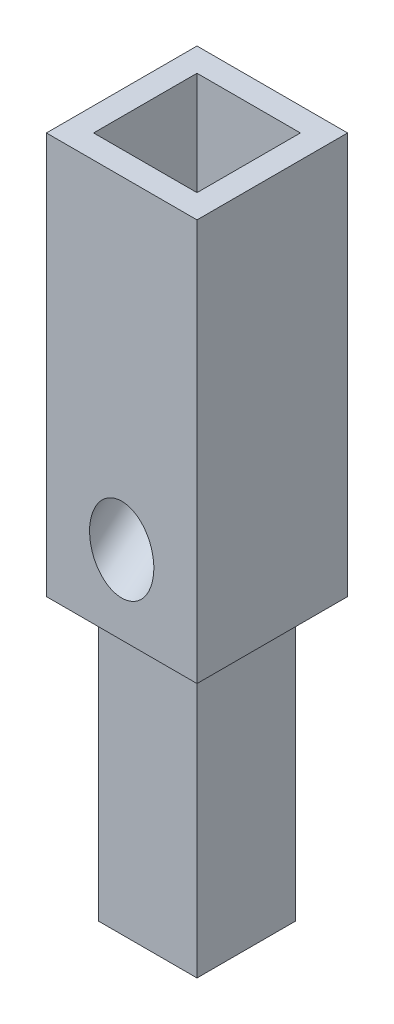
ISO-10303-21;
HEADER;
FILE_DESCRIPTION(('STEP AP214'),'2;1');
FILE_NAME('part.step','',(''),(''),'','','');
FILE_SCHEMA(('AUTOMOTIVE_DESIGN { 1 0 10303 214 1 1 1 1 }'));
ENDSEC;
DATA;
#1=APPLICATION_CONTEXT('core data for automotive mechanical design processes');
#2=APPLICATION_PROTOCOL_DEFINITION('international standard','automotive_design',2000,#1);
#3=PRODUCT_CONTEXT('',#1,'mechanical');
#4=PRODUCT('Part','Part','',(#3));
#5=PRODUCT_RELATED_PRODUCT_CATEGORY('part','',(#4));
#6=PRODUCT_DEFINITION_FORMATION('','',#4);
#7=PRODUCT_DEFINITION_CONTEXT('part definition',#1,'design');
#8=PRODUCT_DEFINITION('design','',#6,#7);
#9=PRODUCT_DEFINITION_SHAPE('','',#8);
#10=(LENGTH_UNIT() NAMED_UNIT(*) SI_UNIT(.MILLI.,.METRE.));
#11=(NAMED_UNIT(*) PLANE_ANGLE_UNIT() SI_UNIT($,.RADIAN.));
#12=(NAMED_UNIT(*) SI_UNIT($,.STERADIAN.) SOLID_ANGLE_UNIT());
#13=UNCERTAINTY_MEASURE_WITH_UNIT(LENGTH_MEASURE(1.E-05),#10,'distance_accuracy_value','');
#14=(GEOMETRIC_REPRESENTATION_CONTEXT(3) GLOBAL_UNCERTAINTY_ASSIGNED_CONTEXT((#13)) GLOBAL_UNIT_ASSIGNED_CONTEXT((#10,
#11,#12)) REPRESENTATION_CONTEXT('',''));
#15=CARTESIAN_POINT('',(0.,0.,0.));
#16=DIRECTION('',(0.,0.,1.));
#17=DIRECTION('',(1.,0.,0.));
#18=AXIS2_PLACEMENT_3D('',#15,#16,#17);
#19=CARTESIAN_POINT('',(0.,40.,0.));
#20=DIRECTION('',(0.,-1.,0.));
#21=DIRECTION('',(0.,0.,-1.));
#22=AXIS2_PLACEMENT_3D('',#19,#20,#21);
#23=CYLINDRICAL_SURFACE('',#22,1.5);
#24=CARTESIAN_POINT('',(0.,-22.,0.));
#25=DIRECTION('',(0.,-1.,0.));
#26=DIRECTION('',(0.,0.,-1.));
#27=AXIS2_PLACEMENT_3D('',#24,#25,#26);
#28=CIRCLE('',#27,1.5);
#29=CARTESIAN_POINT('',(0.,-22.,-1.5));
#30=VERTEX_POINT('',#29);
#31=EDGE_CURVE('E191',#30,#30,#28,.F.);
#32=ORIENTED_EDGE('',*,*,#31,.F.);
#33=EDGE_LOOP('',(#32));
#34=FACE_BOUND('',#33,.T.);
#35=CARTESIAN_POINT('',(0.,8.86246899813989,0.));
#36=DIRECTION('',(0.,0.642787609686543,-0.766044443118975));
#37=DIRECTION('',(0.,-0.766044443118975,-0.642787609686543));
#38=AXIS2_PLACEMENT_3D('',#35,#36,#37);
#39=ELLIPSE('',#38,2.3335857402906,1.5);
#40=CARTESIAN_POINT('',(-1.32342374985116,9.70394289122004,0.706080433328866));
#41=VERTEX_POINT('',#40);
#42=CARTESIAN_POINT('',(1.32342374985116,9.70394289122004,0.706080433328869));
#43=VERTEX_POINT('',#42);
#44=EDGE_CURVE('E144',#41,#43,#39,.F.);
#45=ORIENTED_EDGE('',*,*,#44,.F.);
#46=CARTESIAN_POINT('',(-1.32342374985116,9.70394289122003,0.706080433328872));
#47=CARTESIAN_POINT('',(-1.29809805979963,9.64918894404574,0.753464789128271));
#48=CARTESIAN_POINT('',(-1.27025618535511,9.59446845614418,0.799595815889314));
#49=CARTESIAN_POINT('',(-1.20914240775964,9.48560571786241,0.889363305520722));
#50=CARTESIAN_POINT('',(-1.17584985773644,9.43146653434773,0.932989396374026));
#51=CARTESIAN_POINT('',(-1.10313135384855,9.32397800446016,1.01797062923041));
#52=CARTESIAN_POINT('',(-1.06362717608213,9.2706498344641,1.05928617517818));
#53=CARTESIAN_POINT('',(-0.978349076067662,9.1666908168111,1.13851567754857));
#54=CARTESIAN_POINT('',(-0.932586580661705,9.1160552815575,1.17643562972124));
#55=CARTESIAN_POINT('',(-0.838894902925371,9.02365103594939,1.24469836110505));
#56=CARTESIAN_POINT('',(-0.791625119704653,8.98150041979813,1.27541960074314));
#57=CARTESIAN_POINT('',(-0.690859753028765,8.90212519664404,1.33269056093925));
#58=CARTESIAN_POINT('',(-0.637373128256204,8.86489366252349,1.35924615770489));
#59=CARTESIAN_POINT('',(-0.522858886092545,8.79697945956512,1.4073153649948));
#60=CARTESIAN_POINT('',(-0.461724661126474,8.76641063190946,1.42874186474205));
#61=CARTESIAN_POINT('',(-0.333230096387986,8.71583884720162,1.46401586334333));
#62=CARTESIAN_POINT('',(-0.265893601792679,8.6957972588482,1.47789107964277));
#63=CARTESIAN_POINT('',(-0.149217563705861,8.67345801481185,1.49333021073063));
#64=CARTESIAN_POINT('',(-0.100888692725763,8.66756001412028,1.49739516103013));
#65=CARTESIAN_POINT('',(-0.00370701040952694,8.66264860265226,1.50078090828461));
#66=CARTESIAN_POINT('',(0.0451456520270447,8.66363328454895,1.5001030195736));
#67=CARTESIAN_POINT('',(0.141834857734815,8.67238953806387,1.49406435795262));
#68=CARTESIAN_POINT('',(0.189673058359401,8.68014899810762,1.48871194189977));
#69=CARTESIAN_POINT('',(0.283259561541475,8.70173141924471,1.4737759897235));
#70=CARTESIAN_POINT('',(0.329006441841132,8.71555844095048,1.46418962007076));
#71=CARTESIAN_POINT('',(0.43529722336835,8.75477854636256,1.43687398682346));
#72=CARTESIAN_POINT('',(0.494502806780166,8.78258416475726,1.41742282808018));
#73=CARTESIAN_POINT('',(0.606781721179693,8.84534669414839,1.37312774064124));
#74=CARTESIAN_POINT('',(0.659839671340787,8.88032096046678,1.348270715238));
#75=CARTESIAN_POINT('',(0.788560100661072,8.97656564616294,1.27912342030214));
#76=CARTESIAN_POINT('',(0.859867923334039,9.04146147922713,1.23183241605552));
#77=CARTESIAN_POINT('',(0.989821179658713,9.17805008031879,1.13008424664213));
#78=CARTESIAN_POINT('',(1.04842320145953,9.24976498301355,1.07560350518714));
#79=CARTESIAN_POINT('',(1.14620876264468,9.38533435498894,0.969816364484091));
#80=CARTESIAN_POINT('',(1.18699420389934,9.4486848060689,0.919326302645739));
#81=CARTESIAN_POINT('',(1.24242188833636,9.54430816091368,0.841068017279851));
#82=CARTESIAN_POINT('',(1.25986973447346,9.57612932665661,0.814692858657374));
#83=CARTESIAN_POINT('',(1.29297694096266,9.63993895889759,0.761052632581956));
#84=CARTESIAN_POINT('',(1.30863667160881,9.67192738931728,0.733787750887584));
#85=CARTESIAN_POINT('',(1.32342374985116,9.70394289122003,0.706080433328873));
#86=B_SPLINE_CURVE_WITH_KNOTS('',3,(#46,#47,#48,#49,#50,#51,#52,#53,#54,#55,#56,#57,#58,#59,#60,
#61,#62,#63,#64,#65,#66,#67,#68,#69,#70,#71,#72,#73,#74,#75,#76,#77,#78,#79,#80,#81,#82,#83,#84,
#85),.UNSPECIFIED.,.F.,.F.,(4,2,2,2,2,2,2,2,2,2,2,2,2,2,2,2,2,2,2,4),(0.,0.23013199328184,
0.461156788512066,0.695366321999815,0.929153792214539,1.13987180272697,1.3502898405558,
1.56406173375028,1.7770435792355,1.92295141975555,2.06881882794367,2.21442599515704,
2.36013075645666,2.5636980042364,2.76776403699354,3.08815153310026,3.40961702287541,
3.68126800608189,3.81581825177724,3.95034058324462),.UNSPECIFIED.);
#87=EDGE_CURVE('E48',#41,#43,#86,.T.);
#88=ORIENTED_EDGE('',*,*,#87,.T.);
#89=EDGE_LOOP('',(#45,#88));
#90=FACE_BOUND('',#89,.T.);
#91=ADVANCED_FACE('F35',(#34,#90),#23,.F.);
#92=CARTESIAN_POINT('',(0.,15.,0.));
#93=DIRECTION('',(0.,1.,0.));
#94=DIRECTION('',(0.,0.,1.));
#95=AXIS2_PLACEMENT_3D('',#92,#93,#94);
#96=PLANE('',#95);
#97=DIRECTION('',(0.,0.,1.));
#98=VECTOR('',#97,1.);
#99=CARTESIAN_POINT('',(-5.15,15.,5.15));
#100=LINE('',#99,#98);
#101=CARTESIAN_POINT('',(-5.15,15.,-5.15));
#102=VERTEX_POINT('',#101);
#103=CARTESIAN_POINT('',(-5.15,15.,-4.95));
#104=VERTEX_POINT('',#103);
#105=EDGE_CURVE('E161',#102,#104,#100,.T.);
#106=ORIENTED_EDGE('',*,*,#105,.T.);
#107=DIRECTION('',(1.,0.,0.));
#108=VECTOR('',#107,1.);
#109=CARTESIAN_POINT('',(-20.8628106512901,15.,-4.95));
#110=LINE('',#109,#108);
#111=CARTESIAN_POINT('',(5.15,15.,-4.95));
#112=VERTEX_POINT('',#111);
#113=EDGE_CURVE('E145',#104,#112,#110,.T.);
#114=ORIENTED_EDGE('',*,*,#113,.T.);
#115=DIRECTION('',(0.,0.,-1.));
#116=VECTOR('',#115,1.);
#117=CARTESIAN_POINT('',(5.15,15.,5.15));
#118=LINE('',#117,#116);
#119=CARTESIAN_POINT('',(5.15,15.,-5.15000000000001));
#120=VERTEX_POINT('',#119);
#121=EDGE_CURVE('E167',#112,#120,#118,.T.);
#122=ORIENTED_EDGE('',*,*,#121,.T.);
#123=DIRECTION('',(-1.,0.,0.));
#124=VECTOR('',#123,1.);
#125=CARTESIAN_POINT('',(5.15,15.,-5.15000000000001));
#126=LINE('',#125,#124);
#127=EDGE_CURVE('E169',#120,#102,#126,.T.);
#128=ORIENTED_EDGE('',*,*,#127,.T.);
#129=EDGE_LOOP('',(#106,#114,#122,#128));
#130=FACE_BOUND('',#129,.T.);
#131=ADVANCED_FACE('F261',(#130),#96,.T.);
#132=CARTESIAN_POINT('',(0.,0.,0.));
#133=DIRECTION('',(0.,1.,0.));
#134=DIRECTION('',(0.,0.,1.));
#135=AXIS2_PLACEMENT_3D('',#132,#133,#134);
#136=PLANE('',#135);
#137=DIRECTION('',(0.,0.,1.));
#138=VECTOR('',#137,1.);
#139=CARTESIAN_POINT('',(-7.5,0.,7.5));
#140=LINE('',#139,#138);
#141=CARTESIAN_POINT('',(-7.5,0.,-7.5));
#142=VERTEX_POINT('',#141);
#143=CARTESIAN_POINT('',(-7.5,0.,7.5));
#144=VERTEX_POINT('',#143);
#145=EDGE_CURVE('E227',#142,#144,#140,.T.);
#146=ORIENTED_EDGE('',*,*,#145,.F.);
#147=DIRECTION('',(-1.,0.,0.));
#148=VECTOR('',#147,1.);
#149=CARTESIAN_POINT('',(7.5,0.,-7.50000000000001));
#150=LINE('',#149,#148);
#151=CARTESIAN_POINT('',(7.5,0.,-7.50000000000001));
#152=VERTEX_POINT('',#151);
#153=EDGE_CURVE('E232',#152,#142,#150,.T.);
#154=ORIENTED_EDGE('',*,*,#153,.F.);
#155=DIRECTION('',(0.,0.,-1.));
#156=VECTOR('',#155,1.);
#157=CARTESIAN_POINT('',(7.5,0.,7.49999999999999));
#158=LINE('',#157,#156);
#159=CARTESIAN_POINT('',(7.5,0.,7.49999999999999));
#160=VERTEX_POINT('',#159);
#161=EDGE_CURVE('E243',#160,#152,#158,.T.);
#162=ORIENTED_EDGE('',*,*,#161,.F.);
#163=DIRECTION('',(1.,0.,0.));
#164=VECTOR('',#163,1.);
#165=CARTESIAN_POINT('',(7.5,0.,7.49999999999999));
#166=LINE('',#165,#164);
#167=EDGE_CURVE('E241',#144,#160,#166,.T.);
#168=ORIENTED_EDGE('',*,*,#167,.F.);
#169=EDGE_LOOP('',(#146,#154,#162,#168));
#170=FACE_BOUND('',#169,.T.);
#171=DIRECTION('',(0.,0.,1.));
#172=VECTOR('',#171,1.);
#173=CARTESIAN_POINT('',(4.9,0.,4.9));
#174=LINE('',#173,#172);
#175=CARTESIAN_POINT('',(4.9,0.,-4.9));
#176=VERTEX_POINT('',#175);
#177=CARTESIAN_POINT('',(4.9,0.,4.9));
#178=VERTEX_POINT('',#177);
#179=EDGE_CURVE('E205',#176,#178,#174,.T.);
#180=ORIENTED_EDGE('',*,*,#179,.F.);
#181=DIRECTION('',(1.,0.,0.));
#182=VECTOR('',#181,1.);
#183=CARTESIAN_POINT('',(-4.9,0.,-4.9));
#184=LINE('',#183,#182);
#185=CARTESIAN_POINT('',(-4.9,0.,-4.9));
#186=VERTEX_POINT('',#185);
#187=EDGE_CURVE('E198',#186,#176,#184,.T.);
#188=ORIENTED_EDGE('',*,*,#187,.F.);
#189=DIRECTION('',(0.,0.,-1.));
#190=VECTOR('',#189,1.);
#191=CARTESIAN_POINT('',(-4.9,0.,4.9));
#192=LINE('',#191,#190);
#193=CARTESIAN_POINT('',(-4.9,0.,4.9));
#194=VERTEX_POINT('',#193);
#195=EDGE_CURVE('E211',#194,#186,#192,.T.);
#196=ORIENTED_EDGE('',*,*,#195,.F.);
#197=DIRECTION('',(-1.,0.,0.));
#198=VECTOR('',#197,1.);
#199=CARTESIAN_POINT('',(-4.9,0.,4.9));
#200=LINE('',#199,#198);
#201=EDGE_CURVE('E208',#178,#194,#200,.T.);
#202=ORIENTED_EDGE('',*,*,#201,.F.);
#203=EDGE_LOOP('',(#180,#188,#196,#202));
#204=FACE_BOUND('',#203,.T.);
#205=ADVANCED_FACE('F266',(#170,#204),#136,.F.);
#206=CARTESIAN_POINT('',(-7.5,40.,7.5));
#207=DIRECTION('',(1.,0.,0.));
#208=DIRECTION('',(0.,0.,-1.));
#209=AXIS2_PLACEMENT_3D('',#206,#207,#208);
#210=PLANE('',#209);
#211=ORIENTED_EDGE('',*,*,#145,.T.);
#212=DIRECTION('',(0.,-1.,0.));
#213=VECTOR('',#212,1.);
#214=CARTESIAN_POINT('',(-7.5,40.,7.5));
#215=LINE('',#214,#213);
#216=CARTESIAN_POINT('',(-7.5,40.,7.5));
#217=VERTEX_POINT('',#216);
#218=EDGE_CURVE('E43',#217,#144,#215,.T.);
#219=ORIENTED_EDGE('',*,*,#218,.F.);
#220=DIRECTION('',(0.,0.,1.));
#221=VECTOR('',#220,1.);
#222=CARTESIAN_POINT('',(-7.5,40.,7.5));
#223=LINE('',#222,#221);
#224=CARTESIAN_POINT('',(-7.5,40.,-7.5));
#225=VERTEX_POINT('',#224);
#226=EDGE_CURVE('E228',#225,#217,#223,.T.);
#227=ORIENTED_EDGE('',*,*,#226,.F.);
#228=DIRECTION('',(0.,-1.,0.));
#229=VECTOR('',#228,1.);
#230=CARTESIAN_POINT('',(-7.5,40.,-7.5));
#231=LINE('',#230,#229);
#232=EDGE_CURVE('E238',#225,#142,#231,.T.);
#233=ORIENTED_EDGE('',*,*,#232,.T.);
#234=EDGE_LOOP('',(#211,#219,#227,#233));
#235=FACE_BOUND('',#234,.T.);
#236=ADVANCED_FACE('F37',(#235),#210,.F.);
#237=CARTESIAN_POINT('',(7.5,40.,7.49999999999999));
#238=DIRECTION('',(0.,0.,-1.));
#239=DIRECTION('',(-1.,0.,0.));
#240=AXIS2_PLACEMENT_3D('',#237,#238,#239);
#241=PLANE('',#240);
#242=CARTESIAN_POINT('',(0.,7.80648670940424,7.49999999999999));
#243=DIRECTION('',(0.,0.,-1.));
#244=DIRECTION('',(0.,1.,0.));
#245=AXIS2_PLACEMENT_3D('',#242,#243,#244);
#246=ELLIPSE('',#245,4.17730332586331,3.2);
#247=CARTESIAN_POINT('',(0.,11.9837900352675,7.49999999999999));
#248=VERTEX_POINT('',#247);
#249=EDGE_CURVE('E146',#248,#248,#246,.T.);
#250=ORIENTED_EDGE('',*,*,#249,.T.);
#251=EDGE_LOOP('',(#250));
#252=FACE_BOUND('',#251,.T.);
#253=ORIENTED_EDGE('',*,*,#167,.T.);
#254=DIRECTION('',(0.,-1.,0.));
#255=VECTOR('',#254,1.);
#256=CARTESIAN_POINT('',(7.5,40.,7.49999999999999));
#257=LINE('',#256,#255);
#258=CARTESIAN_POINT('',(7.5,40.,7.49999999999999));
#259=VERTEX_POINT('',#258);
#260=EDGE_CURVE('E251',#259,#160,#257,.T.);
#261=ORIENTED_EDGE('',*,*,#260,.F.);
#262=DIRECTION('',(1.,0.,0.));
#263=VECTOR('',#262,1.);
#264=CARTESIAN_POINT('',(7.5,40.,7.49999999999999));
#265=LINE('',#264,#263);
#266=EDGE_CURVE('E231',#217,#259,#265,.T.);
#267=ORIENTED_EDGE('',*,*,#266,.F.);
#268=ORIENTED_EDGE('',*,*,#218,.T.);
#269=EDGE_LOOP('',(#253,#261,#267,#268));
#270=FACE_BOUND('',#269,.T.);
#271=ADVANCED_FACE('F342',(#252,#270),#241,.F.);
#272=CARTESIAN_POINT('',(7.5,40.,7.49999999999999));
#273=DIRECTION('',(-1.,0.,0.));
#274=DIRECTION('',(0.,0.,1.));
#275=AXIS2_PLACEMENT_3D('',#272,#273,#274);
#276=PLANE('',#275);
#277=ORIENTED_EDGE('',*,*,#161,.T.);
#278=DIRECTION('',(0.,-1.,0.));
#279=VECTOR('',#278,1.);
#280=CARTESIAN_POINT('',(7.5,40.,-7.50000000000001));
#281=LINE('',#280,#279);
#282=CARTESIAN_POINT('',(7.5,40.,-7.50000000000001));
#283=VERTEX_POINT('',#282);
#284=EDGE_CURVE('E248',#283,#152,#281,.T.);
#285=ORIENTED_EDGE('',*,*,#284,.F.);
#286=DIRECTION('',(0.,0.,-1.));
#287=VECTOR('',#286,1.);
#288=CARTESIAN_POINT('',(7.5,40.,7.49999999999999));
#289=LINE('',#288,#287);
#290=EDGE_CURVE('E234',#259,#283,#289,.T.);
#291=ORIENTED_EDGE('',*,*,#290,.F.);
#292=ORIENTED_EDGE('',*,*,#260,.T.);
#293=EDGE_LOOP('',(#277,#285,#291,#292));
#294=FACE_BOUND('',#293,.T.);
#295=ADVANCED_FACE('F352',(#294),#276,.F.);
#296=CARTESIAN_POINT('',(7.5,40.,-7.50000000000001));
#297=DIRECTION('',(0.,0.,1.));
#298=DIRECTION('',(1.,0.,0.));
#299=AXIS2_PLACEMENT_3D('',#296,#297,#298);
#300=PLANE('',#299);
#301=ORIENTED_EDGE('',*,*,#153,.T.);
#302=ORIENTED_EDGE('',*,*,#232,.F.);
#303=DIRECTION('',(-1.,0.,0.));
#304=VECTOR('',#303,1.);
#305=CARTESIAN_POINT('',(7.5,40.,-7.50000000000001));
#306=LINE('',#305,#304);
#307=EDGE_CURVE('E236',#283,#225,#306,.T.);
#308=ORIENTED_EDGE('',*,*,#307,.F.);
#309=ORIENTED_EDGE('',*,*,#284,.T.);
#310=EDGE_LOOP('',(#301,#302,#308,#309));
#311=FACE_BOUND('',#310,.T.);
#312=ADVANCED_FACE('F349',(#311),#300,.F.);
#313=CARTESIAN_POINT('',(0.,40.,0.));
#314=DIRECTION('',(0.,1.,0.));
#315=DIRECTION('',(0.,0.,1.));
#316=AXIS2_PLACEMENT_3D('',#313,#314,#315);
#317=PLANE('',#316);
#318=DIRECTION('',(0.,0.,1.));
#319=VECTOR('',#318,1.);
#320=CARTESIAN_POINT('',(-5.15,40.,5.15));
#321=LINE('',#320,#319);
#322=CARTESIAN_POINT('',(-5.15,40.,-5.15));
#323=VERTEX_POINT('',#322);
#324=CARTESIAN_POINT('',(-5.15,40.,5.15));
#325=VERTEX_POINT('',#324);
#326=EDGE_CURVE('E56',#323,#325,#321,.T.);
#327=ORIENTED_EDGE('',*,*,#326,.F.);
#328=DIRECTION('',(-1.,0.,0.));
#329=VECTOR('',#328,1.);
#330=CARTESIAN_POINT('',(5.15,40.,-5.15000000000001));
#331=LINE('',#330,#329);
#332=CARTESIAN_POINT('',(5.15,40.,-5.15000000000001));
#333=VERTEX_POINT('',#332);
#334=EDGE_CURVE('E165',#333,#323,#331,.T.);
#335=ORIENTED_EDGE('',*,*,#334,.F.);
#336=DIRECTION('',(0.,0.,-1.));
#337=VECTOR('',#336,1.);
#338=CARTESIAN_POINT('',(5.15,40.,5.15));
#339=LINE('',#338,#337);
#340=CARTESIAN_POINT('',(5.15,40.,5.15));
#341=VERTEX_POINT('',#340);
#342=EDGE_CURVE('E175',#341,#333,#339,.T.);
#343=ORIENTED_EDGE('',*,*,#342,.F.);
#344=DIRECTION('',(1.,0.,0.));
#345=VECTOR('',#344,1.);
#346=CARTESIAN_POINT('',(5.15,40.,5.15));
#347=LINE('',#346,#345);
#348=EDGE_CURVE('E152',#325,#341,#347,.T.);
#349=ORIENTED_EDGE('',*,*,#348,.F.);
#350=EDGE_LOOP('',(#327,#335,#343,#349));
#351=FACE_BOUND('',#350,.T.);
#352=ORIENTED_EDGE('',*,*,#226,.T.);
#353=ORIENTED_EDGE('',*,*,#266,.T.);
#354=ORIENTED_EDGE('',*,*,#290,.T.);
#355=ORIENTED_EDGE('',*,*,#307,.T.);
#356=EDGE_LOOP('',(#352,#353,#354,#355));
#357=FACE_BOUND('',#356,.T.);
#358=ADVANCED_FACE('F347',(#351,#357),#317,.T.);
#359=CARTESIAN_POINT('',(4.9,-28.,4.9));
#360=DIRECTION('',(-1.,0.,0.));
#361=DIRECTION('',(0.,0.,1.));
#362=AXIS2_PLACEMENT_3D('',#359,#360,#361);
#363=PLANE('',#362);
#364=ORIENTED_EDGE('',*,*,#179,.T.);
#365=DIRECTION('',(0.,1.,0.));
#366=VECTOR('',#365,1.);
#367=CARTESIAN_POINT('',(4.9,-28.,4.9));
#368=LINE('',#367,#366);
#369=CARTESIAN_POINT('',(4.9,-28.,4.9));
#370=VERTEX_POINT('',#369);
#371=EDGE_CURVE('E224',#370,#178,#368,.T.);
#372=ORIENTED_EDGE('',*,*,#371,.F.);
#373=DIRECTION('',(0.,0.,1.));
#374=VECTOR('',#373,1.);
#375=CARTESIAN_POINT('',(4.9,-28.,4.9));
#376=LINE('',#375,#374);
#377=CARTESIAN_POINT('',(4.9,-28.,-4.9));
#378=VERTEX_POINT('',#377);
#379=EDGE_CURVE('E194',#378,#370,#376,.T.);
#380=ORIENTED_EDGE('',*,*,#379,.F.);
#381=DIRECTION('',(0.,1.,0.));
#382=VECTOR('',#381,1.);
#383=CARTESIAN_POINT('',(4.9,-28.,-4.9));
#384=LINE('',#383,#382);
#385=EDGE_CURVE('E204',#378,#176,#384,.T.);
#386=ORIENTED_EDGE('',*,*,#385,.T.);
#387=EDGE_LOOP('',(#364,#372,#380,#386));
#388=FACE_BOUND('',#387,.T.);
#389=ADVANCED_FACE('F327',(#388),#363,.F.);
#390=CARTESIAN_POINT('',(-4.9,-28.,4.9));
#391=DIRECTION('',(0.,0.,-1.));
#392=DIRECTION('',(-1.,0.,0.));
#393=AXIS2_PLACEMENT_3D('',#390,#391,#392);
#394=PLANE('',#393);
#395=ORIENTED_EDGE('',*,*,#201,.T.);
#396=DIRECTION('',(0.,1.,0.));
#397=VECTOR('',#396,1.);
#398=CARTESIAN_POINT('',(-4.9,-28.,4.9));
#399=LINE('',#398,#397);
#400=CARTESIAN_POINT('',(-4.9,-28.,4.9));
#401=VERTEX_POINT('',#400);
#402=EDGE_CURVE('E221',#401,#194,#399,.T.);
#403=ORIENTED_EDGE('',*,*,#402,.F.);
#404=DIRECTION('',(-1.,0.,0.));
#405=VECTOR('',#404,1.);
#406=CARTESIAN_POINT('',(-4.9,-28.,4.9));
#407=LINE('',#406,#405);
#408=EDGE_CURVE('E197',#370,#401,#407,.T.);
#409=ORIENTED_EDGE('',*,*,#408,.F.);
#410=ORIENTED_EDGE('',*,*,#371,.T.);
#411=EDGE_LOOP('',(#395,#403,#409,#410));
#412=FACE_BOUND('',#411,.T.);
#413=ADVANCED_FACE('F329',(#412),#394,.F.);
#414=CARTESIAN_POINT('',(-4.9,-28.,4.9));
#415=DIRECTION('',(1.,0.,0.));
#416=DIRECTION('',(0.,0.,-1.));
#417=AXIS2_PLACEMENT_3D('',#414,#415,#416);
#418=PLANE('',#417);
#419=ORIENTED_EDGE('',*,*,#195,.T.);
#420=DIRECTION('',(0.,1.,0.));
#421=VECTOR('',#420,1.);
#422=CARTESIAN_POINT('',(-4.9,-28.,-4.9));
#423=LINE('',#422,#421);
#424=CARTESIAN_POINT('',(-4.9,-28.,-4.9));
#425=VERTEX_POINT('',#424);
#426=EDGE_CURVE('E218',#425,#186,#423,.T.);
#427=ORIENTED_EDGE('',*,*,#426,.F.);
#428=DIRECTION('',(0.,0.,-1.));
#429=VECTOR('',#428,1.);
#430=CARTESIAN_POINT('',(-4.9,-28.,4.9));
#431=LINE('',#430,#429);
#432=EDGE_CURVE('E200',#401,#425,#431,.T.);
#433=ORIENTED_EDGE('',*,*,#432,.F.);
#434=ORIENTED_EDGE('',*,*,#402,.T.);
#435=EDGE_LOOP('',(#419,#427,#433,#434));
#436=FACE_BOUND('',#435,.T.);
#437=ADVANCED_FACE('F333',(#436),#418,.F.);
#438=CARTESIAN_POINT('',(-4.9,-28.,-4.9));
#439=DIRECTION('',(0.,0.,1.));
#440=DIRECTION('',(1.,0.,0.));
#441=AXIS2_PLACEMENT_3D('',#438,#439,#440);
#442=PLANE('',#441);
#443=ORIENTED_EDGE('',*,*,#187,.T.);
#444=ORIENTED_EDGE('',*,*,#385,.F.);
#445=DIRECTION('',(1.,0.,0.));
#446=VECTOR('',#445,1.);
#447=CARTESIAN_POINT('',(-4.9,-28.,-4.9));
#448=LINE('',#447,#446);
#449=EDGE_CURVE('E202',#425,#378,#448,.T.);
#450=ORIENTED_EDGE('',*,*,#449,.F.);
#451=ORIENTED_EDGE('',*,*,#426,.T.);
#452=EDGE_LOOP('',(#443,#444,#450,#451));
#453=FACE_BOUND('',#452,.T.);
#454=ADVANCED_FACE('F315',(#453),#442,.F.);
#455=CARTESIAN_POINT('',(0.,-28.,0.));
#456=DIRECTION('',(0.,-1.,0.));
#457=DIRECTION('',(0.,0.,-1.));
#458=AXIS2_PLACEMENT_3D('',#455,#456,#457);
#459=PLANE('',#458);
#460=CARTESIAN_POINT('',(0.,-28.,0.));
#461=DIRECTION('',(0.,-1.,0.));
#462=DIRECTION('',(0.,0.,-1.));
#463=AXIS2_PLACEMENT_3D('',#460,#461,#462);
#464=CIRCLE('',#463,3.5);
#465=CARTESIAN_POINT('',(0.,-28.,-3.5));
#466=VERTEX_POINT('',#465);
#467=EDGE_CURVE('E182',#466,#466,#464,.T.);
#468=ORIENTED_EDGE('',*,*,#467,.F.);
#469=EDGE_LOOP('',(#468));
#470=FACE_BOUND('',#469,.T.);
#471=ORIENTED_EDGE('',*,*,#379,.T.);
#472=ORIENTED_EDGE('',*,*,#408,.T.);
#473=ORIENTED_EDGE('',*,*,#432,.T.);
#474=ORIENTED_EDGE('',*,*,#449,.T.);
#475=EDGE_LOOP('',(#471,#472,#473,#474));
#476=FACE_BOUND('',#475,.T.);
#477=ADVANCED_FACE('F274',(#470,#476),#459,.T.);
#478=CARTESIAN_POINT('',(0.,-22.,0.));
#479=DIRECTION('',(0.,-1.,0.));
#480=DIRECTION('',(0.,0.,-1.));
#481=AXIS2_PLACEMENT_3D('',#478,#479,#480);
#482=PLANE('',#481);
#483=CARTESIAN_POINT('',(0.,-22.,0.));
#484=DIRECTION('',(0.,-1.,0.));
#485=DIRECTION('',(0.,0.,-1.));
#486=AXIS2_PLACEMENT_3D('',#483,#484,#485);
#487=CIRCLE('',#486,3.5);
#488=CARTESIAN_POINT('',(0.,-22.,-3.5));
#489=VERTEX_POINT('',#488);
#490=EDGE_CURVE('E188',#489,#489,#487,.T.);
#491=ORIENTED_EDGE('',*,*,#490,.T.);
#492=EDGE_LOOP('',(#491));
#493=FACE_BOUND('',#492,.T.);
#494=ORIENTED_EDGE('',*,*,#31,.T.);
#495=EDGE_LOOP('',(#494));
#496=FACE_BOUND('',#495,.T.);
#497=ADVANCED_FACE('F258',(#493,#496),#482,.T.);
#498=CARTESIAN_POINT('',(0.,-22.,0.));
#499=DIRECTION('',(0.,-1.,0.));
#500=DIRECTION('',(0.,0.,-1.));
#501=AXIS2_PLACEMENT_3D('',#498,#499,#500);
#502=CYLINDRICAL_SURFACE('',#501,3.5);
#503=ORIENTED_EDGE('',*,*,#490,.F.);
#504=EDGE_LOOP('',(#503));
#505=FACE_BOUND('',#504,.T.);
#506=ORIENTED_EDGE('',*,*,#467,.T.);
#507=EDGE_LOOP('',(#506));
#508=FACE_BOUND('',#507,.T.);
#509=ADVANCED_FACE('F272',(#505,#508),#502,.F.);
#510=CARTESIAN_POINT('',(-5.15,15.,5.15));
#511=DIRECTION('',(-1.,0.,0.));
#512=DIRECTION('',(0.,0.,1.));
#513=AXIS2_PLACEMENT_3D('',#510,#511,#512);
#514=PLANE('',#513);
#515=ORIENTED_EDGE('',*,*,#326,.T.);
#516=DIRECTION('',(0.,1.,0.));
#517=VECTOR('',#516,1.);
#518=CARTESIAN_POINT('',(-5.15,15.,5.15));
#519=LINE('',#518,#517);
#520=CARTESIAN_POINT('',(-5.15,15.,5.15));
#521=VERTEX_POINT('',#520);
#522=EDGE_CURVE('E171',#521,#325,#519,.T.);
#523=ORIENTED_EDGE('',*,*,#522,.F.);
#524=DIRECTION('',(0.,0.766044443118975,0.642787609686543));
#525=VECTOR('',#524,1.);
#526=CARTESIAN_POINT('',(-5.15,15.,5.15));
#527=LINE('',#526,#525);
#528=CARTESIAN_POINT('',(-5.15,2.96328871479861,-4.95));
#529=VERTEX_POINT('',#528);
#530=EDGE_CURVE('E155',#529,#521,#527,.T.);
#531=ORIENTED_EDGE('',*,*,#530,.F.);
#532=DIRECTION('',(0.,-1.,0.));
#533=VECTOR('',#532,1.);
#534=CARTESIAN_POINT('',(-5.15,2.96328871479861,-4.95));
#535=LINE('',#534,#533);
#536=EDGE_CURVE('E150',#104,#529,#535,.T.);
#537=ORIENTED_EDGE('',*,*,#536,.F.);
#538=ORIENTED_EDGE('',*,*,#105,.F.);
#539=DIRECTION('',(0.,1.,0.));
#540=VECTOR('',#539,1.);
#541=CARTESIAN_POINT('',(-5.15,15.,-5.15));
#542=LINE('',#541,#540);
#543=EDGE_CURVE('E180',#102,#323,#542,.T.);
#544=ORIENTED_EDGE('',*,*,#543,.T.);
#545=EDGE_LOOP('',(#515,#523,#531,#537,#538,#544));
#546=FACE_BOUND('',#545,.T.);
#547=ADVANCED_FACE('F299',(#546),#514,.F.);
#548=CARTESIAN_POINT('',(5.15,15.,-5.15000000000001));
#549=DIRECTION('',(0.,0.,-1.));
#550=DIRECTION('',(-1.,0.,0.));
#551=AXIS2_PLACEMENT_3D('',#548,#549,#550);
#552=PLANE('',#551);
#553=ORIENTED_EDGE('',*,*,#334,.T.);
#554=ORIENTED_EDGE('',*,*,#543,.F.);
#555=ORIENTED_EDGE('',*,*,#127,.F.);
#556=DIRECTION('',(0.,1.,0.));
#557=VECTOR('',#556,1.);
#558=CARTESIAN_POINT('',(5.15,15.,-5.15000000000001));
#559=LINE('',#558,#557);
#560=EDGE_CURVE('E183',#120,#333,#559,.T.);
#561=ORIENTED_EDGE('',*,*,#560,.T.);
#562=EDGE_LOOP('',(#553,#554,#555,#561));
#563=FACE_BOUND('',#562,.T.);
#564=ADVANCED_FACE('F295',(#563),#552,.F.);
#565=CARTESIAN_POINT('',(5.15,15.,5.15));
#566=DIRECTION('',(1.,0.,0.));
#567=DIRECTION('',(0.,0.,-1.));
#568=AXIS2_PLACEMENT_3D('',#565,#566,#567);
#569=PLANE('',#568);
#570=ORIENTED_EDGE('',*,*,#342,.T.);
#571=ORIENTED_EDGE('',*,*,#560,.F.);
#572=ORIENTED_EDGE('',*,*,#121,.F.);
#573=DIRECTION('',(0.,-1.,0.));
#574=VECTOR('',#573,1.);
#575=CARTESIAN_POINT('',(5.15,2.96328871479861,-4.95));
#576=LINE('',#575,#574);
#577=CARTESIAN_POINT('',(5.15,2.96328871479861,-4.95));
#578=VERTEX_POINT('',#577);
#579=EDGE_CURVE('E389',#112,#578,#576,.T.);
#580=ORIENTED_EDGE('',*,*,#579,.T.);
#581=DIRECTION('',(0.,0.766044443118975,0.642787609686543));
#582=VECTOR('',#581,1.);
#583=CARTESIAN_POINT('',(5.15,15.,5.15));
#584=LINE('',#583,#582);
#585=CARTESIAN_POINT('',(5.15,15.,5.15));
#586=VERTEX_POINT('',#585);
#587=EDGE_CURVE('E282',#578,#586,#584,.T.);
#588=ORIENTED_EDGE('',*,*,#587,.T.);
#589=DIRECTION('',(0.,1.,0.));
#590=VECTOR('',#589,1.);
#591=CARTESIAN_POINT('',(5.15,15.,5.15));
#592=LINE('',#591,#590);
#593=EDGE_CURVE('E185',#586,#341,#592,.T.);
#594=ORIENTED_EDGE('',*,*,#593,.T.);
#595=EDGE_LOOP('',(#570,#571,#572,#580,#588,#594));
#596=FACE_BOUND('',#595,.T.);
#597=ADVANCED_FACE('F298',(#596),#569,.F.);
#598=CARTESIAN_POINT('',(5.15,15.,5.15));
#599=DIRECTION('',(0.,0.,1.));
#600=DIRECTION('',(1.,0.,0.));
#601=AXIS2_PLACEMENT_3D('',#598,#599,#600);
#602=PLANE('',#601);
#603=ORIENTED_EDGE('',*,*,#348,.T.);
#604=ORIENTED_EDGE('',*,*,#593,.F.);
#605=DIRECTION('',(1.,0.,0.));
#606=VECTOR('',#605,1.);
#607=CARTESIAN_POINT('',(5.15,15.,5.15));
#608=LINE('',#607,#606);
#609=EDGE_CURVE('E164',#521,#586,#608,.T.);
#610=ORIENTED_EDGE('',*,*,#609,.F.);
#611=ORIENTED_EDGE('',*,*,#522,.T.);
#612=EDGE_LOOP('',(#603,#604,#610,#611));
#613=FACE_BOUND('',#612,.T.);
#614=ADVANCED_FACE('F291',(#613),#602,.F.);
#615=CARTESIAN_POINT('',(-20.8628106512901,15.,5.15));
#616=DIRECTION('',(0.,0.642787609686543,-0.766044443118975));
#617=DIRECTION('',(0.,0.766044443118975,0.642787609686543));
#618=AXIS2_PLACEMENT_3D('',#615,#616,#617);
#619=PLANE('',#618);
#620=CARTESIAN_POINT('',(0.,11.9358222275241,2.57884956125382));
#621=DIRECTION('',(0.,0.642787609686543,-0.766044443118975));
#622=DIRECTION('',(0.,0.766044443118975,0.642787609686543));
#623=AXIS2_PLACEMENT_3D('',#620,#621,#622);
#624=CIRCLE('',#623,3.2);
#625=EDGE_CURVE('E11',#41,#43,#624,.T.);
#626=ORIENTED_EDGE('',*,*,#625,.F.);
#627=ORIENTED_EDGE('',*,*,#44,.T.);
#628=EDGE_LOOP('',(#626,#627));
#629=FACE_BOUND('',#628,.T.);
#630=ORIENTED_EDGE('',*,*,#530,.T.);
#631=ORIENTED_EDGE('',*,*,#609,.T.);
#632=ORIENTED_EDGE('',*,*,#587,.F.);
#633=DIRECTION('',(1.,0.,0.));
#634=VECTOR('',#633,1.);
#635=CARTESIAN_POINT('',(-20.8628106512901,2.96328871479861,-4.95));
#636=LINE('',#635,#634);
#637=EDGE_CURVE('E159',#529,#578,#636,.T.);
#638=ORIENTED_EDGE('',*,*,#637,.F.);
#639=EDGE_LOOP('',(#630,#631,#632,#638));
#640=FACE_BOUND('',#639,.T.);
#641=ADVANCED_FACE('F148',(#629,#640),#619,.T.);
#642=CARTESIAN_POINT('',(-20.8628106512901,2.96328871479861,-4.95));
#643=DIRECTION('',(0.,0.,1.));
#644=DIRECTION('',(1.,0.,0.));
#645=AXIS2_PLACEMENT_3D('',#642,#643,#644);
#646=PLANE('',#645);
#647=ORIENTED_EDGE('',*,*,#536,.T.);
#648=ORIENTED_EDGE('',*,*,#637,.T.);
#649=ORIENTED_EDGE('',*,*,#579,.F.);
#650=ORIENTED_EDGE('',*,*,#113,.F.);
#651=EDGE_LOOP('',(#647,#648,#649,#650));
#652=FACE_BOUND('',#651,.T.);
#653=ADVANCED_FACE('F287',(#652),#646,.T.);
#654=CARTESIAN_POINT('',(0.,-6.98789106242648,25.131252859775));
#655=DIRECTION('',(0.,0.642787609686544,-0.766044443118974));
#656=DIRECTION('',(0.,0.766044443118975,0.642787609686544));
#657=AXIS2_PLACEMENT_3D('',#654,#655,#656);
#658=CYLINDRICAL_SURFACE('',#657,3.2);
#659=ORIENTED_EDGE('',*,*,#249,.F.);
#660=EDGE_LOOP('',(#659));
#661=FACE_BOUND('',#660,.T.);
#662=ORIENTED_EDGE('',*,*,#625,.T.);
#663=ORIENTED_EDGE('',*,*,#87,.F.);
#664=EDGE_LOOP('',(#662,#663));
#665=FACE_BOUND('',#664,.T.);
#666=ADVANCED_FACE('F139',(#661,#665),#658,.F.);
#667=CLOSED_SHELL('',(#91,#131,#205,#236,#271,#295,#312,#358,#389,#413,#437,#454,#477,#497,#509,
#547,#564,#597,#614,#641,#653,#666));
#668=MANIFOLD_SOLID_BREP('B2',#667);
#669=ADVANCED_BREP_SHAPE_REPRESENTATION('',(#18,#668),#14);
#670=SHAPE_DEFINITION_REPRESENTATION(#9,#669);
ENDSEC;
END-ISO-10303-21;
